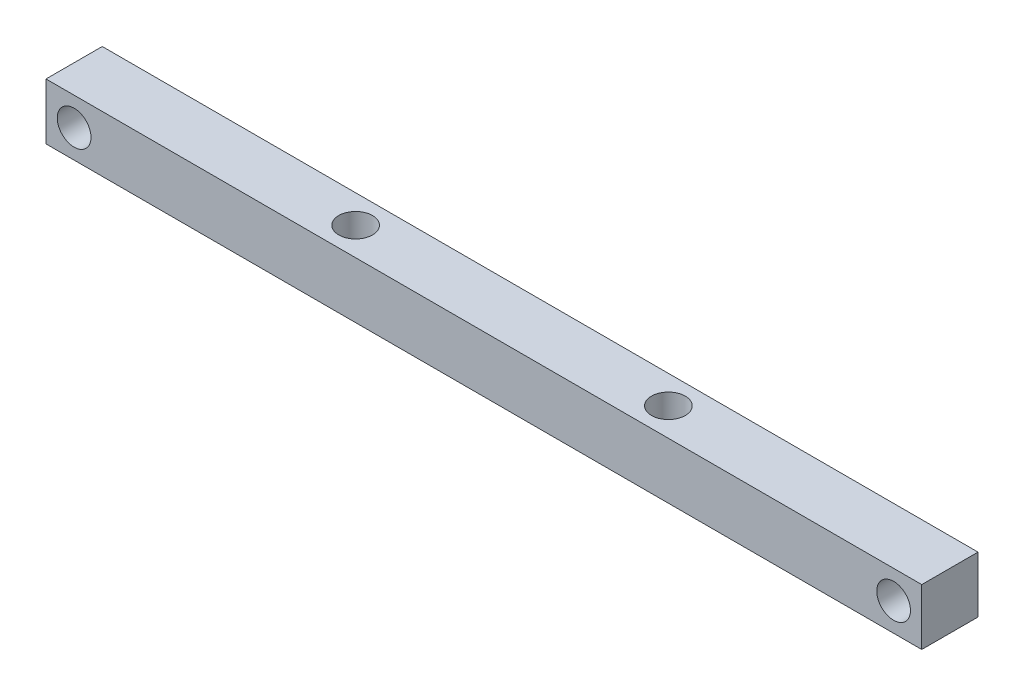
ISO-10303-21;
HEADER;
FILE_DESCRIPTION(('STEP AP214'),'2;1');
FILE_NAME('part.step','',(''),(''),'','','');
FILE_SCHEMA(('AUTOMOTIVE_DESIGN { 1 0 10303 214 1 1 1 1 }'));
ENDSEC;
DATA;
#1=APPLICATION_CONTEXT('core data for automotive mechanical design processes');
#2=APPLICATION_PROTOCOL_DEFINITION('international standard','automotive_design',2000,#1);
#3=PRODUCT_CONTEXT('',#1,'mechanical');
#4=PRODUCT('Part','Part','',(#3));
#5=PRODUCT_RELATED_PRODUCT_CATEGORY('part','',(#4));
#6=PRODUCT_DEFINITION_FORMATION('','',#4);
#7=PRODUCT_DEFINITION_CONTEXT('part definition',#1,'design');
#8=PRODUCT_DEFINITION('design','',#6,#7);
#9=PRODUCT_DEFINITION_SHAPE('','',#8);
#10=(LENGTH_UNIT() NAMED_UNIT(*) SI_UNIT(.MILLI.,.METRE.));
#11=(NAMED_UNIT(*) PLANE_ANGLE_UNIT() SI_UNIT($,.RADIAN.));
#12=(NAMED_UNIT(*) SI_UNIT($,.STERADIAN.) SOLID_ANGLE_UNIT());
#13=UNCERTAINTY_MEASURE_WITH_UNIT(LENGTH_MEASURE(1.E-05),#10,'distance_accuracy_value','');
#14=(GEOMETRIC_REPRESENTATION_CONTEXT(3) GLOBAL_UNCERTAINTY_ASSIGNED_CONTEXT((#13)) GLOBAL_UNIT_ASSIGNED_CONTEXT((#10,
#11,#12)) REPRESENTATION_CONTEXT('',''));
#15=CARTESIAN_POINT('',(0.,0.,0.));
#16=DIRECTION('',(0.,0.,1.));
#17=DIRECTION('',(1.,0.,0.));
#18=AXIS2_PLACEMENT_3D('',#15,#16,#17);
#19=CARTESIAN_POINT('',(-103.708862750764,50.8242108844806,6.35));
#20=DIRECTION('',(1.,0.,0.));
#21=DIRECTION('',(0.,0.,-1.));
#22=AXIS2_PLACEMENT_3D('',#19,#20,#21);
#23=PLANE('',#22);
#24=DIRECTION('',(0.,-1.,0.));
#25=VECTOR('',#24,1.);
#26=CARTESIAN_POINT('',(-103.708862750764,50.8242108844806,0.));
#27=LINE('',#26,#25);
#28=CARTESIAN_POINT('',(-103.708862750764,50.8242108844806,0.));
#29=VERTEX_POINT('',#28);
#30=CARTESIAN_POINT('',(-103.708862750764,44.4742108844806,0.));
#31=VERTEX_POINT('',#30);
#32=EDGE_CURVE('E95',#29,#31,#27,.T.);
#33=ORIENTED_EDGE('',*,*,#32,.T.);
#34=DIRECTION('',(0.,0.,-1.));
#35=VECTOR('',#34,1.);
#36=CARTESIAN_POINT('',(-103.708862750764,44.4742108844806,6.35));
#37=LINE('',#36,#35);
#38=CARTESIAN_POINT('',(-103.708862750764,44.4742108844806,6.35));
#39=VERTEX_POINT('',#38);
#40=EDGE_CURVE('E11',#39,#31,#37,.T.);
#41=ORIENTED_EDGE('',*,*,#40,.F.);
#42=DIRECTION('',(0.,-1.,0.));
#43=VECTOR('',#42,1.);
#44=CARTESIAN_POINT('',(-103.708862750764,50.8242108844806,6.35));
#45=LINE('',#44,#43);
#46=CARTESIAN_POINT('',(-103.708862750764,50.8242108844806,6.35));
#47=VERTEX_POINT('',#46);
#48=EDGE_CURVE('E83',#47,#39,#45,.T.);
#49=ORIENTED_EDGE('',*,*,#48,.F.);
#50=DIRECTION('',(0.,0.,-1.));
#51=VECTOR('',#50,1.);
#52=CARTESIAN_POINT('',(-103.708862750764,50.8242108844806,6.35));
#53=LINE('',#52,#51);
#54=EDGE_CURVE('E91',#47,#29,#53,.T.);
#55=ORIENTED_EDGE('',*,*,#54,.T.);
#56=EDGE_LOOP('',(#33,#41,#49,#55));
#57=FACE_BOUND('',#56,.T.);
#58=ADVANCED_FACE('F32',(#57),#23,.F.);
#59=CARTESIAN_POINT('',(-103.708862750764,44.4742108844806,6.35));
#60=DIRECTION('',(0.,1.,0.));
#61=DIRECTION('',(0.,0.,1.));
#62=AXIS2_PLACEMENT_3D('',#59,#60,#61);
#63=PLANE('',#62);
#64=CARTESIAN_POINT('',(-36.6274627507644,44.4742108844806,3.175));
#65=DIRECTION('',(0.,1.,0.));
#66=DIRECTION('',(0.,0.,1.));
#67=AXIS2_PLACEMENT_3D('',#64,#65,#66);
#68=CIRCLE('',#67,1.905);
#69=CARTESIAN_POINT('',(-36.6274627507644,44.4742108844806,5.08));
#70=VERTEX_POINT('',#69);
#71=EDGE_CURVE('E124',#70,#70,#68,.T.);
#72=ORIENTED_EDGE('',*,*,#71,.T.);
#73=EDGE_LOOP('',(#72));
#74=FACE_BOUND('',#73,.T.);
#75=CARTESIAN_POINT('',(-71.9334627507644,44.4742108844806,3.175));
#76=DIRECTION('',(0.,1.,0.));
#77=DIRECTION('',(0.,0.,1.));
#78=AXIS2_PLACEMENT_3D('',#75,#76,#77);
#79=CIRCLE('',#78,1.90500000000001);
#80=CARTESIAN_POINT('',(-71.9334627507644,44.4742108844806,5.08000000000001));
#81=VERTEX_POINT('',#80);
#82=EDGE_CURVE('E118',#81,#81,#79,.T.);
#83=ORIENTED_EDGE('',*,*,#82,.T.);
#84=EDGE_LOOP('',(#83));
#85=FACE_BOUND('',#84,.T.);
#86=DIRECTION('',(1.,0.,0.));
#87=VECTOR('',#86,1.);
#88=CARTESIAN_POINT('',(-103.708862750764,44.4742108844806,0.));
#89=LINE('',#88,#87);
#90=CARTESIAN_POINT('',(-4.85206275076441,44.4742108844806,0.));
#91=VERTEX_POINT('',#90);
#92=EDGE_CURVE('E87',#31,#91,#89,.T.);
#93=ORIENTED_EDGE('',*,*,#92,.T.);
#94=DIRECTION('',(0.,0.,-1.));
#95=VECTOR('',#94,1.);
#96=CARTESIAN_POINT('',(-4.85206275076441,44.4742108844806,6.35));
#97=LINE('',#96,#95);
#98=CARTESIAN_POINT('',(-4.85206275076441,44.4742108844806,6.35));
#99=VERTEX_POINT('',#98);
#100=EDGE_CURVE('E40',#99,#91,#97,.T.);
#101=ORIENTED_EDGE('',*,*,#100,.F.);
#102=DIRECTION('',(1.,0.,0.));
#103=VECTOR('',#102,1.);
#104=CARTESIAN_POINT('',(-103.708862750764,44.4742108844806,6.35));
#105=LINE('',#104,#103);
#106=EDGE_CURVE('E78',#39,#99,#105,.T.);
#107=ORIENTED_EDGE('',*,*,#106,.F.);
#108=ORIENTED_EDGE('',*,*,#40,.T.);
#109=EDGE_LOOP('',(#93,#101,#107,#108));
#110=FACE_BOUND('',#109,.T.);
#111=ADVANCED_FACE('F86',(#74,#85,#110),#63,.F.);
#112=CARTESIAN_POINT('',(-4.85206275076441,50.8242108844806,6.35));
#113=DIRECTION('',(-1.,0.,0.));
#114=DIRECTION('',(0.,-1.,0.));
#115=AXIS2_PLACEMENT_3D('',#112,#113,#114);
#116=PLANE('',#115);
#117=DIRECTION('',(0.,1.,0.));
#118=VECTOR('',#117,1.);
#119=CARTESIAN_POINT('',(-4.85206275076441,50.8242108844806,0.));
#120=LINE('',#119,#118);
#121=CARTESIAN_POINT('',(-4.85206275076441,50.8242108844806,0.));
#122=VERTEX_POINT('',#121);
#123=EDGE_CURVE('E65',#91,#122,#120,.T.);
#124=ORIENTED_EDGE('',*,*,#123,.T.);
#125=DIRECTION('',(0.,0.,-1.));
#126=VECTOR('',#125,1.);
#127=CARTESIAN_POINT('',(-4.85206275076441,50.8242108844806,6.35));
#128=LINE('',#127,#126);
#129=CARTESIAN_POINT('',(-4.85206275076441,50.8242108844806,6.35));
#130=VERTEX_POINT('',#129);
#131=EDGE_CURVE('E88',#130,#122,#128,.T.);
#132=ORIENTED_EDGE('',*,*,#131,.F.);
#133=DIRECTION('',(0.,1.,0.));
#134=VECTOR('',#133,1.);
#135=CARTESIAN_POINT('',(-4.85206275076441,50.8242108844806,6.35));
#136=LINE('',#135,#134);
#137=EDGE_CURVE('E81',#99,#130,#136,.T.);
#138=ORIENTED_EDGE('',*,*,#137,.F.);
#139=ORIENTED_EDGE('',*,*,#100,.T.);
#140=EDGE_LOOP('',(#124,#132,#138,#139));
#141=FACE_BOUND('',#140,.T.);
#142=ADVANCED_FACE('F89',(#141),#116,.F.);
#143=CARTESIAN_POINT('',(-103.708862750764,50.8242108844806,6.35));
#144=DIRECTION('',(0.,-1.,0.));
#145=DIRECTION('',(0.,0.,-1.));
#146=AXIS2_PLACEMENT_3D('',#143,#144,#145);
#147=PLANE('',#146);
#148=CARTESIAN_POINT('',(-36.6274627507644,50.8242108844806,3.175));
#149=DIRECTION('',(0.,1.,0.));
#150=DIRECTION('',(0.,0.,1.));
#151=AXIS2_PLACEMENT_3D('',#148,#149,#150);
#152=CIRCLE('',#151,1.905);
#153=CARTESIAN_POINT('',(-36.6274627507644,50.8242108844806,5.08));
#154=VERTEX_POINT('',#153);
#155=EDGE_CURVE('E127',#154,#154,#152,.T.);
#156=ORIENTED_EDGE('',*,*,#155,.F.);
#157=EDGE_LOOP('',(#156));
#158=FACE_BOUND('',#157,.T.);
#159=CARTESIAN_POINT('',(-71.9334627507644,50.8242108844806,3.175));
#160=DIRECTION('',(0.,1.,0.));
#161=DIRECTION('',(0.,0.,1.));
#162=AXIS2_PLACEMENT_3D('',#159,#160,#161);
#163=CIRCLE('',#162,1.90500000000001);
#164=CARTESIAN_POINT('',(-71.9334627507644,50.8242108844806,5.08000000000001));
#165=VERTEX_POINT('',#164);
#166=EDGE_CURVE('E121',#165,#165,#163,.T.);
#167=ORIENTED_EDGE('',*,*,#166,.F.);
#168=EDGE_LOOP('',(#167));
#169=FACE_BOUND('',#168,.T.);
#170=DIRECTION('',(-1.,0.,0.));
#171=VECTOR('',#170,1.);
#172=CARTESIAN_POINT('',(-103.708862750764,50.8242108844806,0.));
#173=LINE('',#172,#171);
#174=EDGE_CURVE('E71',#122,#29,#173,.T.);
#175=ORIENTED_EDGE('',*,*,#174,.T.);
#176=ORIENTED_EDGE('',*,*,#54,.F.);
#177=DIRECTION('',(-1.,0.,0.));
#178=VECTOR('',#177,1.);
#179=CARTESIAN_POINT('',(-103.708862750764,50.8242108844806,6.35));
#180=LINE('',#179,#178);
#181=EDGE_CURVE('E48',#130,#47,#180,.T.);
#182=ORIENTED_EDGE('',*,*,#181,.F.);
#183=ORIENTED_EDGE('',*,*,#131,.T.);
#184=EDGE_LOOP('',(#175,#176,#182,#183));
#185=FACE_BOUND('',#184,.T.);
#186=ADVANCED_FACE('F103',(#158,#169,#185),#147,.F.);
#187=CARTESIAN_POINT('',(0.,0.,6.35));
#188=DIRECTION('',(0.,0.,1.));
#189=DIRECTION('',(1.,0.,0.));
#190=AXIS2_PLACEMENT_3D('',#187,#188,#189);
#191=PLANE('',#190);
#192=CARTESIAN_POINT('',(-8.02706275076441,47.6492108844806,6.35));
#193=DIRECTION('',(0.,0.,1.));
#194=DIRECTION('',(1.,0.,0.));
#195=AXIS2_PLACEMENT_3D('',#192,#193,#194);
#196=CIRCLE('',#195,1.905);
#197=CARTESIAN_POINT('',(-6.12206275076441,47.6492108844806,6.35));
#198=VERTEX_POINT('',#197);
#199=EDGE_CURVE('E115',#198,#198,#196,.T.);
#200=ORIENTED_EDGE('',*,*,#199,.F.);
#201=EDGE_LOOP('',(#200));
#202=FACE_BOUND('',#201,.T.);
#203=CARTESIAN_POINT('',(-100.533862750764,47.6492108844806,6.35));
#204=DIRECTION('',(0.,0.,1.));
#205=DIRECTION('',(1.,0.,0.));
#206=AXIS2_PLACEMENT_3D('',#203,#204,#205);
#207=CIRCLE('',#206,1.90500000000001);
#208=CARTESIAN_POINT('',(-98.6288627507644,47.6492108844806,6.35));
#209=VERTEX_POINT('',#208);
#210=EDGE_CURVE('E109',#209,#209,#207,.T.);
#211=ORIENTED_EDGE('',*,*,#210,.F.);
#212=EDGE_LOOP('',(#211));
#213=FACE_BOUND('',#212,.T.);
#214=ORIENTED_EDGE('',*,*,#48,.T.);
#215=ORIENTED_EDGE('',*,*,#106,.T.);
#216=ORIENTED_EDGE('',*,*,#137,.T.);
#217=ORIENTED_EDGE('',*,*,#181,.T.);
#218=EDGE_LOOP('',(#214,#215,#216,#217));
#219=FACE_BOUND('',#218,.T.);
#220=ADVANCED_FACE('F79',(#202,#213,#219),#191,.T.);
#221=CARTESIAN_POINT('',(0.,0.,0.));
#222=DIRECTION('',(0.,0.,1.));
#223=DIRECTION('',(1.,0.,0.));
#224=AXIS2_PLACEMENT_3D('',#221,#222,#223);
#225=PLANE('',#224);
#226=CARTESIAN_POINT('',(-8.02706275076441,47.6492108844806,0.));
#227=DIRECTION('',(0.,0.,1.));
#228=DIRECTION('',(1.,0.,0.));
#229=AXIS2_PLACEMENT_3D('',#226,#227,#228);
#230=CIRCLE('',#229,1.905);
#231=CARTESIAN_POINT('',(-6.12206275076441,47.6492108844806,0.));
#232=VERTEX_POINT('',#231);
#233=EDGE_CURVE('E112',#232,#232,#230,.T.);
#234=ORIENTED_EDGE('',*,*,#233,.T.);
#235=EDGE_LOOP('',(#234));
#236=FACE_BOUND('',#235,.T.);
#237=CARTESIAN_POINT('',(-100.533862750764,47.6492108844806,0.));
#238=DIRECTION('',(0.,0.,1.));
#239=DIRECTION('',(1.,0.,0.));
#240=AXIS2_PLACEMENT_3D('',#237,#238,#239);
#241=CIRCLE('',#240,1.90500000000001);
#242=CARTESIAN_POINT('',(-98.6288627507644,47.6492108844806,0.));
#243=VERTEX_POINT('',#242);
#244=EDGE_CURVE('E98',#243,#243,#241,.T.);
#245=ORIENTED_EDGE('',*,*,#244,.T.);
#246=EDGE_LOOP('',(#245));
#247=FACE_BOUND('',#246,.T.);
#248=ORIENTED_EDGE('',*,*,#32,.F.);
#249=ORIENTED_EDGE('',*,*,#174,.F.);
#250=ORIENTED_EDGE('',*,*,#123,.F.);
#251=ORIENTED_EDGE('',*,*,#92,.F.);
#252=EDGE_LOOP('',(#248,#249,#250,#251));
#253=FACE_BOUND('',#252,.T.);
#254=ADVANCED_FACE('F106',(#236,#247,#253),#225,.F.);
#255=CARTESIAN_POINT('',(-100.533862750764,47.6492108844806,0.));
#256=DIRECTION('',(0.,0.,1.));
#257=DIRECTION('',(1.,0.,0.));
#258=AXIS2_PLACEMENT_3D('',#255,#256,#257);
#259=CYLINDRICAL_SURFACE('',#258,1.90500000000001);
#260=ORIENTED_EDGE('',*,*,#244,.F.);
#261=EDGE_LOOP('',(#260));
#262=FACE_BOUND('',#261,.T.);
#263=ORIENTED_EDGE('',*,*,#210,.T.);
#264=EDGE_LOOP('',(#263));
#265=FACE_BOUND('',#264,.T.);
#266=ADVANCED_FACE('F154',(#262,#265),#259,.F.);
#267=CARTESIAN_POINT('',(-8.02706275076441,47.6492108844806,0.));
#268=DIRECTION('',(0.,0.,1.));
#269=DIRECTION('',(1.,0.,0.));
#270=AXIS2_PLACEMENT_3D('',#267,#268,#269);
#271=CYLINDRICAL_SURFACE('',#270,1.905);
#272=ORIENTED_EDGE('',*,*,#233,.F.);
#273=EDGE_LOOP('',(#272));
#274=FACE_BOUND('',#273,.T.);
#275=ORIENTED_EDGE('',*,*,#199,.T.);
#276=EDGE_LOOP('',(#275));
#277=FACE_BOUND('',#276,.T.);
#278=ADVANCED_FACE('F148',(#274,#277),#271,.F.);
#279=CARTESIAN_POINT('',(-71.9334627507644,44.4742108844806,3.175));
#280=DIRECTION('',(0.,1.,0.));
#281=DIRECTION('',(0.,0.,1.));
#282=AXIS2_PLACEMENT_3D('',#279,#280,#281);
#283=CYLINDRICAL_SURFACE('',#282,1.90500000000001);
#284=ORIENTED_EDGE('',*,*,#82,.F.);
#285=EDGE_LOOP('',(#284));
#286=FACE_BOUND('',#285,.T.);
#287=ORIENTED_EDGE('',*,*,#166,.T.);
#288=EDGE_LOOP('',(#287));
#289=FACE_BOUND('',#288,.T.);
#290=ADVANCED_FACE('F138',(#286,#289),#283,.F.);
#291=CARTESIAN_POINT('',(-36.6274627507644,44.4742108844806,3.175));
#292=DIRECTION('',(0.,1.,0.));
#293=DIRECTION('',(0.,0.,1.));
#294=AXIS2_PLACEMENT_3D('',#291,#292,#293);
#295=CYLINDRICAL_SURFACE('',#294,1.905);
#296=ORIENTED_EDGE('',*,*,#71,.F.);
#297=EDGE_LOOP('',(#296));
#298=FACE_BOUND('',#297,.T.);
#299=ORIENTED_EDGE('',*,*,#155,.T.);
#300=EDGE_LOOP('',(#299));
#301=FACE_BOUND('',#300,.T.);
#302=ADVANCED_FACE('F135',(#298,#301),#295,.F.);
#303=CLOSED_SHELL('',(#58,#111,#142,#186,#220,#254,#266,#278,#290,#302));
#304=MANIFOLD_SOLID_BREP('B2',#303);
#305=ADVANCED_BREP_SHAPE_REPRESENTATION('',(#18,#304),#14);
#306=SHAPE_DEFINITION_REPRESENTATION(#9,#305);
ENDSEC;
END-ISO-10303-21;
